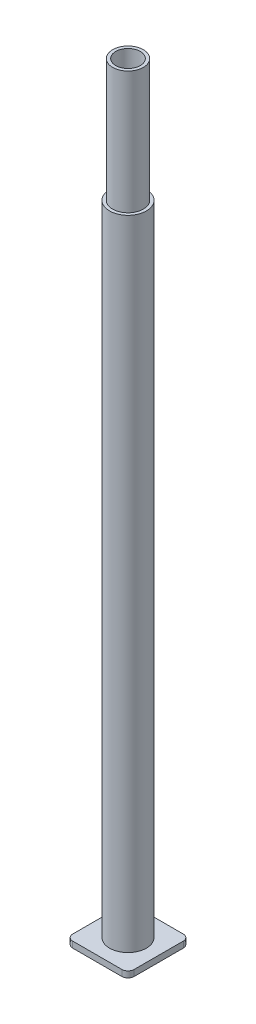
ISO-10303-21;
HEADER;
FILE_DESCRIPTION(('STEP AP214'),'2;1');
FILE_NAME('part.step','',(''),(''),'','','');
FILE_SCHEMA(('AUTOMOTIVE_DESIGN { 1 0 10303 214 1 1 1 1 }'));
ENDSEC;
DATA;
#1=APPLICATION_CONTEXT('core data for automotive mechanical design processes');
#2=APPLICATION_PROTOCOL_DEFINITION('international standard','automotive_design',2000,#1);
#3=PRODUCT_CONTEXT('',#1,'mechanical');
#4=PRODUCT('Part','Part','',(#3));
#5=PRODUCT_RELATED_PRODUCT_CATEGORY('part','',(#4));
#6=PRODUCT_DEFINITION_FORMATION('','',#4);
#7=PRODUCT_DEFINITION_CONTEXT('part definition',#1,'design');
#8=PRODUCT_DEFINITION('design','',#6,#7);
#9=PRODUCT_DEFINITION_SHAPE('','',#8);
#10=(LENGTH_UNIT() NAMED_UNIT(*) SI_UNIT(.MILLI.,.METRE.));
#11=(NAMED_UNIT(*) PLANE_ANGLE_UNIT() SI_UNIT($,.RADIAN.));
#12=(NAMED_UNIT(*) SI_UNIT($,.STERADIAN.) SOLID_ANGLE_UNIT());
#13=UNCERTAINTY_MEASURE_WITH_UNIT(LENGTH_MEASURE(1.E-05),#10,'distance_accuracy_value','');
#14=(GEOMETRIC_REPRESENTATION_CONTEXT(3) GLOBAL_UNCERTAINTY_ASSIGNED_CONTEXT((#13)) GLOBAL_UNIT_ASSIGNED_CONTEXT((#10,
#11,#12)) REPRESENTATION_CONTEXT('',''));
#15=CARTESIAN_POINT('',(0.,0.,0.));
#16=DIRECTION('',(0.,0.,1.));
#17=DIRECTION('',(1.,0.,0.));
#18=AXIS2_PLACEMENT_3D('',#15,#16,#17);
#19=CARTESIAN_POINT('',(0.,1250.,0.));
#20=DIRECTION('',(0.,1.,0.));
#21=DIRECTION('',(-1.,0.,0.));
#22=AXIS2_PLACEMENT_3D('',#19,#20,#21);
#23=CYLINDRICAL_SURFACE('',#22,30.0000000000002);
#24=CARTESIAN_POINT('',(0.,1050.,0.));
#25=DIRECTION('',(0.,1.,0.));
#26=DIRECTION('',(-1.,0.,0.));
#27=AXIS2_PLACEMENT_3D('',#24,#25,#26);
#28=CIRCLE('',#27,30.0000000000001);
#29=CARTESIAN_POINT('',(-30.0000000000002,1050.,0.));
#30=VERTEX_POINT('',#29);
#31=EDGE_CURVE('E132',#30,#30,#28,.T.);
#32=ORIENTED_EDGE('',*,*,#31,.F.);
#33=EDGE_LOOP('',(#32));
#34=FACE_BOUND('',#33,.T.);
#35=CARTESIAN_POINT('',(0.,10.,0.));
#36=DIRECTION('',(0.,-1.,0.));
#37=DIRECTION('',(1.,0.,0.));
#38=AXIS2_PLACEMENT_3D('',#35,#36,#37);
#39=CIRCLE('',#38,30.0000000000002);
#40=CARTESIAN_POINT('',(30.0000000000002,10.,0.));
#41=VERTEX_POINT('',#40);
#42=EDGE_CURVE('E127',#41,#41,#39,.T.);
#43=ORIENTED_EDGE('',*,*,#42,.F.);
#44=EDGE_LOOP('',(#43));
#45=FACE_BOUND('',#44,.T.);
#46=ADVANCED_FACE('F35',(#34,#45),#23,.T.);
#47=CARTESIAN_POINT('',(24.9999999999999,1050.,0.));
#48=DIRECTION('',(0.,-1.,0.));
#49=DIRECTION('',(1.,0.,0.));
#50=AXIS2_PLACEMENT_3D('',#47,#48,#49);
#51=PLANE('',#50);
#52=CARTESIAN_POINT('',(0.,1050.,0.));
#53=DIRECTION('',(0.,1.,0.));
#54=DIRECTION('',(-1.,0.,0.));
#55=AXIS2_PLACEMENT_3D('',#52,#53,#54);
#56=CIRCLE('',#55,25.);
#57=CARTESIAN_POINT('',(-25.0000000000001,1050.,0.));
#58=VERTEX_POINT('',#57);
#59=EDGE_CURVE('E176',#58,#58,#56,.T.);
#60=ORIENTED_EDGE('',*,*,#59,.F.);
#61=EDGE_LOOP('',(#60));
#62=FACE_BOUND('',#61,.T.);
#63=ORIENTED_EDGE('',*,*,#31,.T.);
#64=EDGE_LOOP('',(#63));
#65=FACE_BOUND('',#64,.T.);
#66=ADVANCED_FACE('F181',(#62,#65),#51,.F.);
#67=CARTESIAN_POINT('',(0.,1250.,0.));
#68=DIRECTION('',(0.,1.,0.));
#69=DIRECTION('',(-1.,0.,0.));
#70=AXIS2_PLACEMENT_3D('',#67,#68,#69);
#71=CYLINDRICAL_SURFACE('',#70,25.);
#72=CARTESIAN_POINT('',(0.,1250.,0.));
#73=DIRECTION('',(0.,1.,0.));
#74=DIRECTION('',(-1.,0.,0.));
#75=AXIS2_PLACEMENT_3D('',#72,#73,#74);
#76=CIRCLE('',#75,25.);
#77=CARTESIAN_POINT('',(-25.0000000000001,1250.,0.));
#78=VERTEX_POINT('',#77);
#79=EDGE_CURVE('E161',#78,#78,#76,.T.);
#80=ORIENTED_EDGE('',*,*,#79,.F.);
#81=EDGE_LOOP('',(#80));
#82=FACE_BOUND('',#81,.T.);
#83=ORIENTED_EDGE('',*,*,#59,.T.);
#84=EDGE_LOOP('',(#83));
#85=FACE_BOUND('',#84,.T.);
#86=ADVANCED_FACE('F221',(#82,#85),#71,.T.);
#87=CARTESIAN_POINT('',(24.9999999999999,1250.,0.));
#88=DIRECTION('',(0.,-1.,0.));
#89=DIRECTION('',(1.,0.,0.));
#90=AXIS2_PLACEMENT_3D('',#87,#88,#89);
#91=PLANE('',#90);
#92=CARTESIAN_POINT('',(0.,1250.,0.));
#93=DIRECTION('',(0.,-1.,0.));
#94=DIRECTION('',(1.,0.,0.));
#95=AXIS2_PLACEMENT_3D('',#92,#93,#94);
#96=CIRCLE('',#95,20.);
#97=CARTESIAN_POINT('',(19.9999999999999,1250.,0.));
#98=VERTEX_POINT('',#97);
#99=EDGE_CURVE('E266',#98,#98,#96,.F.);
#100=ORIENTED_EDGE('',*,*,#99,.F.);
#101=EDGE_LOOP('',(#100));
#102=FACE_BOUND('',#101,.T.);
#103=ORIENTED_EDGE('',*,*,#79,.T.);
#104=EDGE_LOOP('',(#103));
#105=FACE_BOUND('',#104,.T.);
#106=ADVANCED_FACE('F225',(#102,#105),#91,.F.);
#107=CARTESIAN_POINT('',(50.,10.,50.));
#108=DIRECTION('',(1.,0.,0.));
#109=DIRECTION('',(0.,1.,0.));
#110=AXIS2_PLACEMENT_3D('',#107,#108,#109);
#111=PLANE('',#110);
#112=DIRECTION('',(0.,0.,1.));
#113=VECTOR('',#112,1.);
#114=CARTESIAN_POINT('',(50.,0.,50.));
#115=LINE('',#114,#113);
#116=CARTESIAN_POINT('',(50.,0.,-40.));
#117=VERTEX_POINT('',#116);
#118=CARTESIAN_POINT('',(50.,0.,40.));
#119=VERTEX_POINT('',#118);
#120=EDGE_CURVE('E166',#117,#119,#115,.T.);
#121=ORIENTED_EDGE('',*,*,#120,.F.);
#122=DIRECTION('',(0.,-1.,0.));
#123=VECTOR('',#122,1.);
#124=CARTESIAN_POINT('',(50.,10.,-40.));
#125=LINE('',#124,#123);
#126=CARTESIAN_POINT('',(50.,10.,-40.));
#127=VERTEX_POINT('',#126);
#128=EDGE_CURVE('E142',#117,#127,#125,.F.);
#129=ORIENTED_EDGE('',*,*,#128,.T.);
#130=DIRECTION('',(0.,0.,1.));
#131=VECTOR('',#130,1.);
#132=CARTESIAN_POINT('',(50.,10.,50.));
#133=LINE('',#132,#131);
#134=CARTESIAN_POINT('',(50.,10.,40.));
#135=VERTEX_POINT('',#134);
#136=EDGE_CURVE('E122',#127,#135,#133,.T.);
#137=ORIENTED_EDGE('',*,*,#136,.T.);
#138=DIRECTION('',(0.,-1.,0.));
#139=VECTOR('',#138,1.);
#140=CARTESIAN_POINT('',(50.,10.,40.));
#141=LINE('',#140,#139);
#142=EDGE_CURVE('E139',#135,#119,#141,.T.);
#143=ORIENTED_EDGE('',*,*,#142,.T.);
#144=EDGE_LOOP('',(#121,#129,#137,#143));
#145=FACE_BOUND('',#144,.T.);
#146=ADVANCED_FACE('F202',(#145),#111,.T.);
#147=CARTESIAN_POINT('',(-50.,10.,-50.));
#148=DIRECTION('',(0.,0.,-1.));
#149=DIRECTION('',(-1.,0.,0.));
#150=AXIS2_PLACEMENT_3D('',#147,#148,#149);
#151=PLANE('',#150);
#152=DIRECTION('',(1.,0.,0.));
#153=VECTOR('',#152,1.);
#154=CARTESIAN_POINT('',(-50.,10.,-50.));
#155=LINE('',#154,#153);
#156=CARTESIAN_POINT('',(-40.,10.,-50.));
#157=VERTEX_POINT('',#156);
#158=CARTESIAN_POINT('',(40.,10.,-50.));
#159=VERTEX_POINT('',#158);
#160=EDGE_CURVE('E158',#157,#159,#155,.T.);
#161=ORIENTED_EDGE('',*,*,#160,.T.);
#162=DIRECTION('',(0.,-1.,0.));
#163=VECTOR('',#162,1.);
#164=CARTESIAN_POINT('',(40.,10.,-50.));
#165=LINE('',#164,#163);
#166=CARTESIAN_POINT('',(40.,0.,-50.));
#167=VERTEX_POINT('',#166);
#168=EDGE_CURVE('E121',#159,#167,#165,.T.);
#169=ORIENTED_EDGE('',*,*,#168,.T.);
#170=DIRECTION('',(1.,0.,0.));
#171=VECTOR('',#170,1.);
#172=CARTESIAN_POINT('',(-50.,0.,-50.));
#173=LINE('',#172,#171);
#174=CARTESIAN_POINT('',(-40.,0.,-50.));
#175=VERTEX_POINT('',#174);
#176=EDGE_CURVE('E104',#175,#167,#173,.T.);
#177=ORIENTED_EDGE('',*,*,#176,.F.);
#178=DIRECTION('',(0.,-1.,0.));
#179=VECTOR('',#178,1.);
#180=CARTESIAN_POINT('',(-40.,10.,-50.));
#181=LINE('',#180,#179);
#182=EDGE_CURVE('E118',#175,#157,#181,.F.);
#183=ORIENTED_EDGE('',*,*,#182,.T.);
#184=EDGE_LOOP('',(#161,#169,#177,#183));
#185=FACE_BOUND('',#184,.T.);
#186=ADVANCED_FACE('F117',(#185),#151,.T.);
#187=CARTESIAN_POINT('',(-50.,10.,50.));
#188=DIRECTION('',(-1.,0.,0.));
#189=DIRECTION('',(0.,-1.,0.));
#190=AXIS2_PLACEMENT_3D('',#187,#188,#189);
#191=PLANE('',#190);
#192=DIRECTION('',(0.,0.,-1.));
#193=VECTOR('',#192,1.);
#194=CARTESIAN_POINT('',(-50.,10.,50.));
#195=LINE('',#194,#193);
#196=CARTESIAN_POINT('',(-50.,10.,40.));
#197=VERTEX_POINT('',#196);
#198=CARTESIAN_POINT('',(-50.,10.,-40.));
#199=VERTEX_POINT('',#198);
#200=EDGE_CURVE('E157',#197,#199,#195,.T.);
#201=ORIENTED_EDGE('',*,*,#200,.T.);
#202=DIRECTION('',(0.,-1.,0.));
#203=VECTOR('',#202,1.);
#204=CARTESIAN_POINT('',(-50.,10.,-40.));
#205=LINE('',#204,#203);
#206=CARTESIAN_POINT('',(-50.,0.,-40.));
#207=VERTEX_POINT('',#206);
#208=EDGE_CURVE('E152',#199,#207,#205,.T.);
#209=ORIENTED_EDGE('',*,*,#208,.T.);
#210=DIRECTION('',(0.,0.,-1.));
#211=VECTOR('',#210,1.);
#212=CARTESIAN_POINT('',(-50.,0.,50.));
#213=LINE('',#212,#211);
#214=CARTESIAN_POINT('',(-50.,0.,40.));
#215=VERTEX_POINT('',#214);
#216=EDGE_CURVE('E106',#215,#207,#213,.T.);
#217=ORIENTED_EDGE('',*,*,#216,.F.);
#218=DIRECTION('',(0.,-1.,0.));
#219=VECTOR('',#218,1.);
#220=CARTESIAN_POINT('',(-50.,10.,40.));
#221=LINE('',#220,#219);
#222=EDGE_CURVE('E150',#215,#197,#221,.F.);
#223=ORIENTED_EDGE('',*,*,#222,.T.);
#224=EDGE_LOOP('',(#201,#209,#217,#223));
#225=FACE_BOUND('',#224,.T.);
#226=ADVANCED_FACE('F155',(#225),#191,.T.);
#227=CARTESIAN_POINT('',(-50.,10.,50.));
#228=DIRECTION('',(0.,0.,1.));
#229=DIRECTION('',(1.,0.,0.));
#230=AXIS2_PLACEMENT_3D('',#227,#228,#229);
#231=PLANE('',#230);
#232=DIRECTION('',(-1.,0.,0.));
#233=VECTOR('',#232,1.);
#234=CARTESIAN_POINT('',(-50.,10.,50.));
#235=LINE('',#234,#233);
#236=CARTESIAN_POINT('',(40.,10.,50.));
#237=VERTEX_POINT('',#236);
#238=CARTESIAN_POINT('',(-40.,10.,50.));
#239=VERTEX_POINT('',#238);
#240=EDGE_CURVE('E159',#237,#239,#235,.T.);
#241=ORIENTED_EDGE('',*,*,#240,.T.);
#242=DIRECTION('',(0.,-1.,0.));
#243=VECTOR('',#242,1.);
#244=CARTESIAN_POINT('',(-40.,10.,50.));
#245=LINE('',#244,#243);
#246=CARTESIAN_POINT('',(-40.,0.,50.));
#247=VERTEX_POINT('',#246);
#248=EDGE_CURVE('E11',#239,#247,#245,.T.);
#249=ORIENTED_EDGE('',*,*,#248,.T.);
#250=DIRECTION('',(-1.,0.,0.));
#251=VECTOR('',#250,1.);
#252=CARTESIAN_POINT('',(-50.,0.,50.));
#253=LINE('',#252,#251);
#254=CARTESIAN_POINT('',(40.,0.,50.));
#255=VERTEX_POINT('',#254);
#256=EDGE_CURVE('E169',#255,#247,#253,.T.);
#257=ORIENTED_EDGE('',*,*,#256,.F.);
#258=DIRECTION('',(0.,-1.,0.));
#259=VECTOR('',#258,1.);
#260=CARTESIAN_POINT('',(40.,10.,50.));
#261=LINE('',#260,#259);
#262=EDGE_CURVE('E43',#255,#237,#261,.F.);
#263=ORIENTED_EDGE('',*,*,#262,.T.);
#264=EDGE_LOOP('',(#241,#249,#257,#263));
#265=FACE_BOUND('',#264,.T.);
#266=ADVANCED_FACE('F190',(#265),#231,.T.);
#267=CARTESIAN_POINT('',(0.,10.,0.));
#268=DIRECTION('',(0.,-1.,0.));
#269=DIRECTION('',(1.,0.,0.));
#270=AXIS2_PLACEMENT_3D('',#267,#268,#269);
#271=PLANE('',#270);
#272=ORIENTED_EDGE('',*,*,#42,.T.);
#273=EDGE_LOOP('',(#272));
#274=FACE_BOUND('',#273,.T.);
#275=ORIENTED_EDGE('',*,*,#136,.F.);
#276=CARTESIAN_POINT('',(40.,10.,-40.));
#277=DIRECTION('',(0.,-1.,0.));
#278=DIRECTION('',(1.,0.,0.));
#279=AXIS2_PLACEMENT_3D('',#276,#277,#278);
#280=CIRCLE('',#279,10.);
#281=EDGE_CURVE('E148',#127,#159,#280,.F.);
#282=ORIENTED_EDGE('',*,*,#281,.T.);
#283=ORIENTED_EDGE('',*,*,#160,.F.);
#284=CARTESIAN_POINT('',(-40.,10.,-40.));
#285=DIRECTION('',(0.,-1.,0.));
#286=DIRECTION('',(1.,0.,0.));
#287=AXIS2_PLACEMENT_3D('',#284,#285,#286);
#288=CIRCLE('',#287,10.);
#289=EDGE_CURVE('E126',#157,#199,#288,.F.);
#290=ORIENTED_EDGE('',*,*,#289,.T.);
#291=ORIENTED_EDGE('',*,*,#200,.F.);
#292=CARTESIAN_POINT('',(-40.,10.,40.));
#293=DIRECTION('',(0.,-1.,0.));
#294=DIRECTION('',(1.,0.,0.));
#295=AXIS2_PLACEMENT_3D('',#292,#293,#294);
#296=CIRCLE('',#295,10.);
#297=EDGE_CURVE('E50',#197,#239,#296,.F.);
#298=ORIENTED_EDGE('',*,*,#297,.T.);
#299=ORIENTED_EDGE('',*,*,#240,.F.);
#300=CARTESIAN_POINT('',(40.,10.,40.));
#301=DIRECTION('',(0.,-1.,0.));
#302=DIRECTION('',(1.,0.,0.));
#303=AXIS2_PLACEMENT_3D('',#300,#301,#302);
#304=CIRCLE('',#303,10.);
#305=EDGE_CURVE('E144',#237,#135,#304,.F.);
#306=ORIENTED_EDGE('',*,*,#305,.T.);
#307=EDGE_LOOP('',(#275,#282,#283,#290,#291,#298,#299,#306));
#308=FACE_BOUND('',#307,.T.);
#309=ADVANCED_FACE('F188',(#274,#308),#271,.F.);
#310=CARTESIAN_POINT('',(0.,0.,0.));
#311=DIRECTION('',(0.,1.,0.));
#312=DIRECTION('',(-1.,0.,0.));
#313=AXIS2_PLACEMENT_3D('',#310,#311,#312);
#314=PLANE('',#313);
#315=ORIENTED_EDGE('',*,*,#176,.T.);
#316=CARTESIAN_POINT('',(40.,0.,-40.));
#317=DIRECTION('',(0.,1.,0.));
#318=DIRECTION('',(-1.,0.,0.));
#319=AXIS2_PLACEMENT_3D('',#316,#317,#318);
#320=CIRCLE('',#319,10.);
#321=EDGE_CURVE('E111',#167,#117,#320,.F.);
#322=ORIENTED_EDGE('',*,*,#321,.T.);
#323=ORIENTED_EDGE('',*,*,#120,.T.);
#324=CARTESIAN_POINT('',(40.,0.,40.));
#325=DIRECTION('',(0.,1.,0.));
#326=DIRECTION('',(-1.,0.,0.));
#327=AXIS2_PLACEMENT_3D('',#324,#325,#326);
#328=CIRCLE('',#327,10.);
#329=EDGE_CURVE('E129',#119,#255,#328,.F.);
#330=ORIENTED_EDGE('',*,*,#329,.T.);
#331=ORIENTED_EDGE('',*,*,#256,.T.);
#332=CARTESIAN_POINT('',(-40.,0.,40.));
#333=DIRECTION('',(0.,1.,0.));
#334=DIRECTION('',(-1.,0.,0.));
#335=AXIS2_PLACEMENT_3D('',#332,#333,#334);
#336=CIRCLE('',#335,10.);
#337=EDGE_CURVE('E112',#247,#215,#336,.F.);
#338=ORIENTED_EDGE('',*,*,#337,.T.);
#339=ORIENTED_EDGE('',*,*,#216,.T.);
#340=CARTESIAN_POINT('',(-40.,0.,-40.));
#341=DIRECTION('',(0.,1.,0.));
#342=DIRECTION('',(-1.,0.,0.));
#343=AXIS2_PLACEMENT_3D('',#340,#341,#342);
#344=CIRCLE('',#343,10.);
#345=EDGE_CURVE('E101',#207,#175,#344,.F.);
#346=ORIENTED_EDGE('',*,*,#345,.T.);
#347=EDGE_LOOP('',(#315,#322,#323,#330,#331,#338,#339,#346));
#348=FACE_BOUND('',#347,.T.);
#349=ADVANCED_FACE('F103',(#348),#314,.F.);
#350=CARTESIAN_POINT('',(40.,10.,-40.));
#351=DIRECTION('',(0.,-1.,0.));
#352=DIRECTION('',(1.,0.,0.));
#353=AXIS2_PLACEMENT_3D('',#350,#351,#352);
#354=CYLINDRICAL_SURFACE('',#353,10.);
#355=ORIENTED_EDGE('',*,*,#281,.F.);
#356=ORIENTED_EDGE('',*,*,#128,.F.);
#357=ORIENTED_EDGE('',*,*,#321,.F.);
#358=ORIENTED_EDGE('',*,*,#168,.F.);
#359=EDGE_LOOP('',(#355,#356,#357,#358));
#360=FACE_BOUND('',#359,.T.);
#361=ADVANCED_FACE('F200',(#360),#354,.T.);
#362=CARTESIAN_POINT('',(-40.,10.,-40.));
#363=DIRECTION('',(0.,-1.,0.));
#364=DIRECTION('',(1.,0.,0.));
#365=AXIS2_PLACEMENT_3D('',#362,#363,#364);
#366=CYLINDRICAL_SURFACE('',#365,10.);
#367=ORIENTED_EDGE('',*,*,#289,.F.);
#368=ORIENTED_EDGE('',*,*,#182,.F.);
#369=ORIENTED_EDGE('',*,*,#345,.F.);
#370=ORIENTED_EDGE('',*,*,#208,.F.);
#371=EDGE_LOOP('',(#367,#368,#369,#370));
#372=FACE_BOUND('',#371,.T.);
#373=ADVANCED_FACE('F125',(#372),#366,.T.);
#374=CARTESIAN_POINT('',(-40.,10.,40.));
#375=DIRECTION('',(0.,-1.,0.));
#376=DIRECTION('',(1.,0.,0.));
#377=AXIS2_PLACEMENT_3D('',#374,#375,#376);
#378=CYLINDRICAL_SURFACE('',#377,10.);
#379=ORIENTED_EDGE('',*,*,#297,.F.);
#380=ORIENTED_EDGE('',*,*,#222,.F.);
#381=ORIENTED_EDGE('',*,*,#337,.F.);
#382=ORIENTED_EDGE('',*,*,#248,.F.);
#383=EDGE_LOOP('',(#379,#380,#381,#382));
#384=FACE_BOUND('',#383,.T.);
#385=ADVANCED_FACE('F206',(#384),#378,.T.);
#386=CARTESIAN_POINT('',(40.,10.,40.));
#387=DIRECTION('',(0.,-1.,0.));
#388=DIRECTION('',(1.,0.,0.));
#389=AXIS2_PLACEMENT_3D('',#386,#387,#388);
#390=CYLINDRICAL_SURFACE('',#389,10.);
#391=ORIENTED_EDGE('',*,*,#305,.F.);
#392=ORIENTED_EDGE('',*,*,#262,.F.);
#393=ORIENTED_EDGE('',*,*,#329,.F.);
#394=ORIENTED_EDGE('',*,*,#142,.F.);
#395=EDGE_LOOP('',(#391,#392,#393,#394));
#396=FACE_BOUND('',#395,.T.);
#397=ADVANCED_FACE('F37',(#396),#390,.T.);
#398=CARTESIAN_POINT('',(0.,1250.,0.));
#399=DIRECTION('',(0.,1.,0.));
#400=DIRECTION('',(-1.,0.,0.));
#401=AXIS2_PLACEMENT_3D('',#398,#399,#400);
#402=CYLINDRICAL_SURFACE('',#401,25.0000000000002);
#403=CARTESIAN_POINT('',(0.,1045.,0.));
#404=DIRECTION('',(0.,-1.,0.));
#405=DIRECTION('',(1.,0.,0.));
#406=AXIS2_PLACEMENT_3D('',#403,#404,#405);
#407=CIRCLE('',#406,25.0000000000002);
#408=CARTESIAN_POINT('',(25.0000000000001,1045.,0.));
#409=VERTEX_POINT('',#408);
#410=EDGE_CURVE('E257',#409,#409,#407,.F.);
#411=ORIENTED_EDGE('',*,*,#410,.T.);
#412=EDGE_LOOP('',(#411));
#413=FACE_BOUND('',#412,.T.);
#414=CARTESIAN_POINT('',(0.,4.99999999999989,0.));
#415=DIRECTION('',(0.,-1.,0.));
#416=DIRECTION('',(1.,0.,0.));
#417=AXIS2_PLACEMENT_3D('',#414,#415,#416);
#418=CIRCLE('',#417,25.0000000000002);
#419=CARTESIAN_POINT('',(25.0000000000002,4.9999999999999,0.));
#420=VERTEX_POINT('',#419);
#421=EDGE_CURVE('E170',#420,#420,#418,.T.);
#422=ORIENTED_EDGE('',*,*,#421,.T.);
#423=EDGE_LOOP('',(#422));
#424=FACE_BOUND('',#423,.T.);
#425=ADVANCED_FACE('F212',(#413,#424),#402,.F.);
#426=CARTESIAN_POINT('',(24.9999999999999,1045.,0.));
#427=DIRECTION('',(0.,-1.,0.));
#428=DIRECTION('',(1.,0.,0.));
#429=AXIS2_PLACEMENT_3D('',#426,#427,#428);
#430=PLANE('',#429);
#431=CARTESIAN_POINT('',(0.,1045.,0.));
#432=DIRECTION('',(0.,-1.,0.));
#433=DIRECTION('',(1.,0.,0.));
#434=AXIS2_PLACEMENT_3D('',#431,#432,#433);
#435=CIRCLE('',#434,20.);
#436=CARTESIAN_POINT('',(19.9999999999999,1045.,0.));
#437=VERTEX_POINT('',#436);
#438=EDGE_CURVE('E261',#437,#437,#435,.F.);
#439=ORIENTED_EDGE('',*,*,#438,.T.);
#440=EDGE_LOOP('',(#439));
#441=FACE_BOUND('',#440,.T.);
#442=ORIENTED_EDGE('',*,*,#410,.F.);
#443=EDGE_LOOP('',(#442));
#444=FACE_BOUND('',#443,.T.);
#445=ADVANCED_FACE('F245',(#441,#444),#430,.T.);
#446=CARTESIAN_POINT('',(0.,1250.,0.));
#447=DIRECTION('',(0.,1.,0.));
#448=DIRECTION('',(-1.,0.,0.));
#449=AXIS2_PLACEMENT_3D('',#446,#447,#448);
#450=CYLINDRICAL_SURFACE('',#449,20.);
#451=ORIENTED_EDGE('',*,*,#99,.T.);
#452=EDGE_LOOP('',(#451));
#453=FACE_BOUND('',#452,.T.);
#454=ORIENTED_EDGE('',*,*,#438,.F.);
#455=EDGE_LOOP('',(#454));
#456=FACE_BOUND('',#455,.T.);
#457=ADVANCED_FACE('F241',(#453,#456),#450,.F.);
#458=CARTESIAN_POINT('',(0.,5.,0.));
#459=DIRECTION('',(0.,1.,0.));
#460=DIRECTION('',(-1.,0.,0.));
#461=AXIS2_PLACEMENT_3D('',#458,#459,#460);
#462=PLANE('',#461);
#463=ORIENTED_EDGE('',*,*,#421,.F.);
#464=EDGE_LOOP('',(#463));
#465=FACE_BOUND('',#464,.T.);
#466=ADVANCED_FACE('F238',(#465),#462,.T.);
#467=CLOSED_SHELL('',(#46,#66,#86,#106,#146,#186,#226,#266,#309,#349,#361,#373,#385,#397,#425,
#445,#457,#466));
#468=MANIFOLD_SOLID_BREP('B2',#467);
#469=ADVANCED_BREP_SHAPE_REPRESENTATION('',(#18,#468),#14);
#470=SHAPE_DEFINITION_REPRESENTATION(#9,#469);
ENDSEC;
END-ISO-10303-21;
